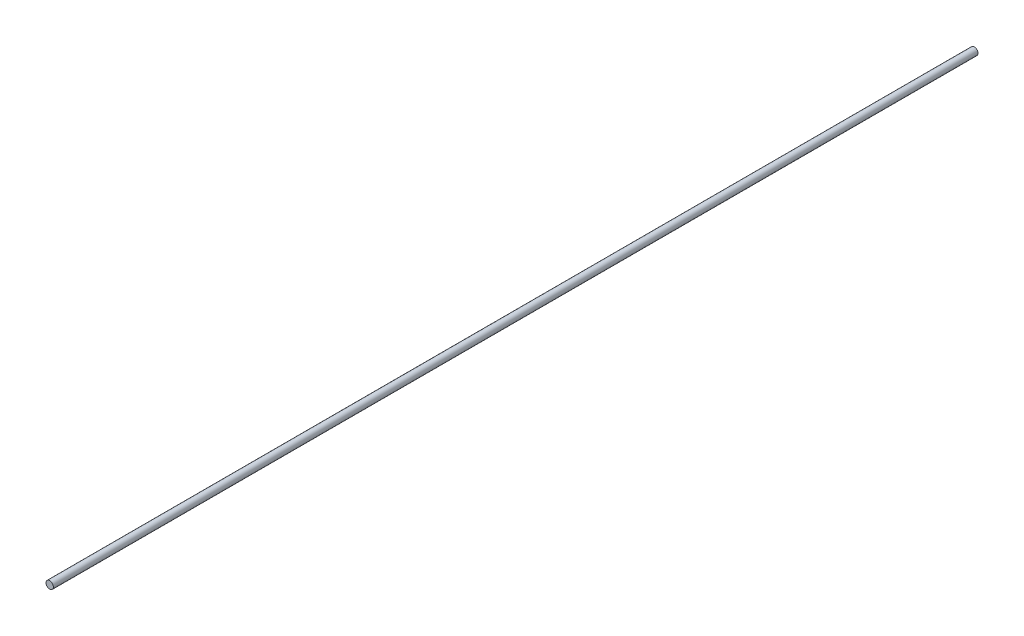
ISO-10303-21;
HEADER;
FILE_DESCRIPTION(('STEP AP214'),'2;1');
FILE_NAME('part.step','',(''),(''),'','','');
FILE_SCHEMA(('AUTOMOTIVE_DESIGN { 1 0 10303 214 1 1 1 1 }'));
ENDSEC;
DATA;
#1=APPLICATION_CONTEXT('core data for automotive mechanical design processes');
#2=APPLICATION_PROTOCOL_DEFINITION('international standard','automotive_design',2000,#1);
#3=PRODUCT_CONTEXT('',#1,'mechanical');
#4=PRODUCT('Part','Part','',(#3));
#5=PRODUCT_RELATED_PRODUCT_CATEGORY('part','',(#4));
#6=PRODUCT_DEFINITION_FORMATION('','',#4);
#7=PRODUCT_DEFINITION_CONTEXT('part definition',#1,'design');
#8=PRODUCT_DEFINITION('design','',#6,#7);
#9=PRODUCT_DEFINITION_SHAPE('','',#8);
#10=(LENGTH_UNIT() NAMED_UNIT(*) SI_UNIT(.MILLI.,.METRE.));
#11=(NAMED_UNIT(*) PLANE_ANGLE_UNIT() SI_UNIT($,.RADIAN.));
#12=(NAMED_UNIT(*) SI_UNIT($,.STERADIAN.) SOLID_ANGLE_UNIT());
#13=UNCERTAINTY_MEASURE_WITH_UNIT(LENGTH_MEASURE(1.E-05),#10,'distance_accuracy_value','');
#14=(GEOMETRIC_REPRESENTATION_CONTEXT(3) GLOBAL_UNCERTAINTY_ASSIGNED_CONTEXT((#13)) GLOBAL_UNIT_ASSIGNED_CONTEXT((#10,
#11,#12)) REPRESENTATION_CONTEXT('',''));
#15=CARTESIAN_POINT('',(0.,0.,0.));
#16=DIRECTION('',(0.,0.,1.));
#17=DIRECTION('',(1.,0.,0.));
#18=AXIS2_PLACEMENT_3D('',#15,#16,#17);
#19=CARTESIAN_POINT('',(65.,0.,-1000.));
#20=DIRECTION('',(0.,0.,1.));
#21=DIRECTION('',(1.,0.,0.));
#22=AXIS2_PLACEMENT_3D('',#19,#20,#21);
#23=CYLINDRICAL_SURFACE('',#22,4.00000000000001);
#24=CARTESIAN_POINT('',(65.,0.,-1000.));
#25=DIRECTION('',(0.,0.,1.));
#26=DIRECTION('',(1.,0.,0.));
#27=AXIS2_PLACEMENT_3D('',#24,#25,#26);
#28=CIRCLE('',#27,4.00000000000001);
#29=CARTESIAN_POINT('',(69.,0.,-1000.));
#30=VERTEX_POINT('',#29);
#31=EDGE_CURVE('E10',#30,#30,#28,.T.);
#32=ORIENTED_EDGE('',*,*,#31,.T.);
#33=EDGE_LOOP('',(#32));
#34=FACE_BOUND('',#33,.T.);
#35=CARTESIAN_POINT('',(65.,0.,0.));
#36=DIRECTION('',(0.,0.,1.));
#37=DIRECTION('',(1.,0.,0.));
#38=AXIS2_PLACEMENT_3D('',#35,#36,#37);
#39=CIRCLE('',#38,4.00000000000001);
#40=CARTESIAN_POINT('',(69.,0.,0.));
#41=VERTEX_POINT('',#40);
#42=EDGE_CURVE('E34',#41,#41,#39,.T.);
#43=ORIENTED_EDGE('',*,*,#42,.F.);
#44=EDGE_LOOP('',(#43));
#45=FACE_BOUND('',#44,.T.);
#46=ADVANCED_FACE('F31',(#34,#45),#23,.T.);
#47=CARTESIAN_POINT('',(65.,0.,-1000.));
#48=DIRECTION('',(0.,0.,1.));
#49=DIRECTION('',(1.,0.,0.));
#50=AXIS2_PLACEMENT_3D('',#47,#48,#49);
#51=PLANE('',#50);
#52=ORIENTED_EDGE('',*,*,#31,.F.);
#53=EDGE_LOOP('',(#52));
#54=FACE_BOUND('',#53,.T.);
#55=ADVANCED_FACE('F46',(#54),#51,.F.);
#56=CARTESIAN_POINT('',(65.,0.,0.));
#57=DIRECTION('',(0.,0.,1.));
#58=DIRECTION('',(1.,0.,0.));
#59=AXIS2_PLACEMENT_3D('',#56,#57,#58);
#60=PLANE('',#59);
#61=ORIENTED_EDGE('',*,*,#42,.T.);
#62=EDGE_LOOP('',(#61));
#63=FACE_BOUND('',#62,.T.);
#64=ADVANCED_FACE('F43',(#63),#60,.T.);
#65=CLOSED_SHELL('',(#46,#55,#64));
#66=MANIFOLD_SOLID_BREP('B2',#65);
#67=ADVANCED_BREP_SHAPE_REPRESENTATION('',(#18,#66),#14);
#68=SHAPE_DEFINITION_REPRESENTATION(#9,#67);
ENDSEC;
END-ISO-10303-21;
